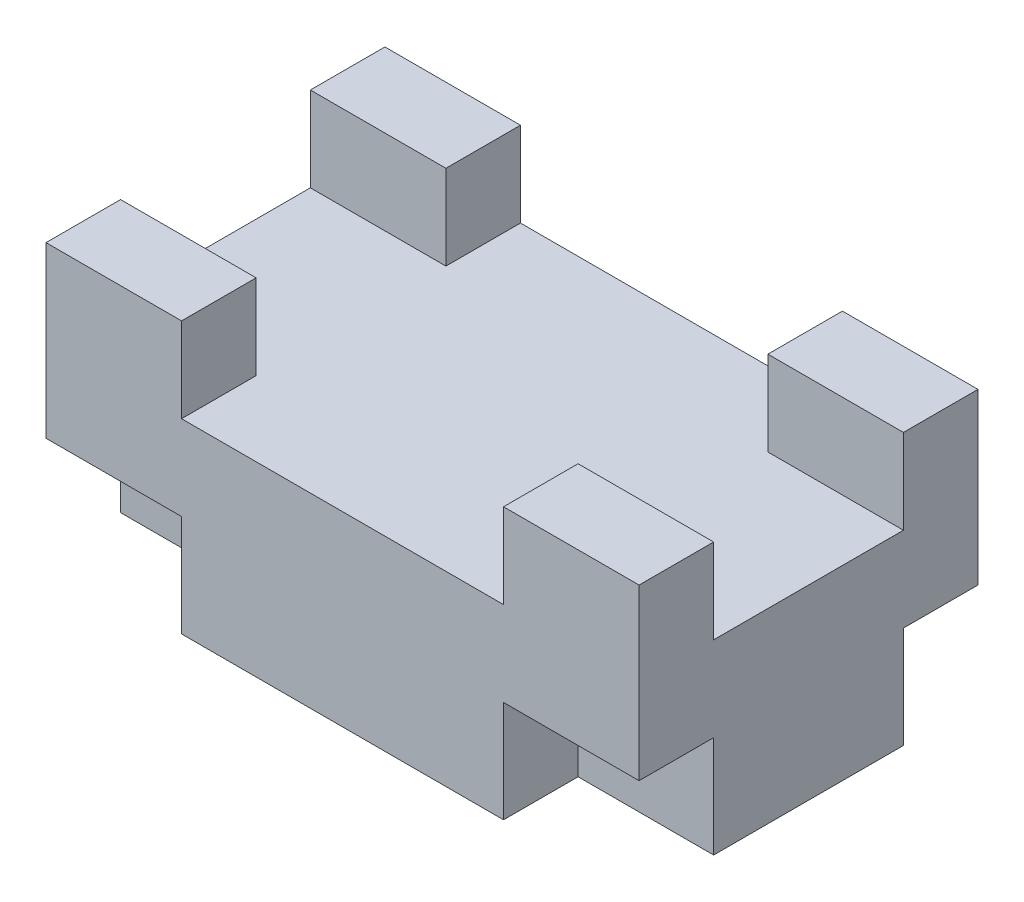
ISO-10303-21;
HEADER;
FILE_DESCRIPTION(('STEP AP214'),'2;1');
FILE_NAME('part.step','',(''),(''),'','','');
FILE_SCHEMA(('AUTOMOTIVE_DESIGN { 1 0 10303 214 1 1 1 1 }'));
ENDSEC;
DATA;
#1=APPLICATION_CONTEXT('core data for automotive mechanical design processes');
#2=APPLICATION_PROTOCOL_DEFINITION('international standard','automotive_design',2000,#1);
#3=PRODUCT_CONTEXT('',#1,'mechanical');
#4=PRODUCT('Part','Part','',(#3));
#5=PRODUCT_RELATED_PRODUCT_CATEGORY('part','',(#4));
#6=PRODUCT_DEFINITION_FORMATION('','',#4);
#7=PRODUCT_DEFINITION_CONTEXT('part definition',#1,'design');
#8=PRODUCT_DEFINITION('design','',#6,#7);
#9=PRODUCT_DEFINITION_SHAPE('','',#8);
#10=(LENGTH_UNIT() NAMED_UNIT(*) SI_UNIT(.MILLI.,.METRE.));
#11=(NAMED_UNIT(*) PLANE_ANGLE_UNIT() SI_UNIT($,.RADIAN.));
#12=(NAMED_UNIT(*) SI_UNIT($,.STERADIAN.) SOLID_ANGLE_UNIT());
#13=UNCERTAINTY_MEASURE_WITH_UNIT(LENGTH_MEASURE(1.E-05),#10,'distance_accuracy_value','');
#14=(GEOMETRIC_REPRESENTATION_CONTEXT(3) GLOBAL_UNCERTAINTY_ASSIGNED_CONTEXT((#13)) GLOBAL_UNIT_ASSIGNED_CONTEXT((#10,
#11,#12)) REPRESENTATION_CONTEXT('',''));
#15=CARTESIAN_POINT('',(0.,0.,0.));
#16=DIRECTION('',(0.,0.,1.));
#17=DIRECTION('',(1.,0.,0.));
#18=AXIS2_PLACEMENT_3D('',#15,#16,#17);
#19=CARTESIAN_POINT('',(0.,55.,0.));
#20=DIRECTION('',(0.,1.,0.));
#21=DIRECTION('',(0.,0.,1.));
#22=AXIS2_PLACEMENT_3D('',#19,#20,#21);
#23=PLANE('',#22);
#24=DIRECTION('',(-1.,0.,0.));
#25=VECTOR('',#24,1.);
#26=CARTESIAN_POINT('',(-47.5,55.,28.));
#27=LINE('',#26,#25);
#28=CARTESIAN_POINT('',(-47.5,55.,28.));
#29=VERTEX_POINT('',#28);
#30=CARTESIAN_POINT('',(-87.5,55.,28.));
#31=VERTEX_POINT('',#30);
#32=EDGE_CURVE('E529',#29,#31,#27,.T.);
#33=ORIENTED_EDGE('',*,*,#32,.F.);
#34=DIRECTION('',(0.,0.,-1.));
#35=VECTOR('',#34,1.);
#36=CARTESIAN_POINT('',(-47.5,55.,50.));
#37=LINE('',#36,#35);
#38=CARTESIAN_POINT('',(-47.5,55.,50.));
#39=VERTEX_POINT('',#38);
#40=EDGE_CURVE('E370',#39,#29,#37,.T.);
#41=ORIENTED_EDGE('',*,*,#40,.F.);
#42=DIRECTION('',(1.,0.,0.));
#43=VECTOR('',#42,1.);
#44=CARTESIAN_POINT('',(-87.5,55.,50.));
#45=LINE('',#44,#43);
#46=CARTESIAN_POINT('',(47.5,55.,50.));
#47=VERTEX_POINT('',#46);
#48=EDGE_CURVE('E272',#39,#47,#45,.T.);
#49=ORIENTED_EDGE('',*,*,#48,.T.);
#50=DIRECTION('',(0.,0.,1.));
#51=VECTOR('',#50,1.);
#52=CARTESIAN_POINT('',(47.5,55.,50.));
#53=LINE('',#52,#51);
#54=CARTESIAN_POINT('',(47.5,55.,28.));
#55=VERTEX_POINT('',#54);
#56=EDGE_CURVE('E367',#55,#47,#53,.T.);
#57=ORIENTED_EDGE('',*,*,#56,.F.);
#58=DIRECTION('',(-1.,0.,0.));
#59=VECTOR('',#58,1.);
#60=CARTESIAN_POINT('',(47.5,55.,28.));
#61=LINE('',#60,#59);
#62=CARTESIAN_POINT('',(87.5,55.,28.));
#63=VERTEX_POINT('',#62);
#64=EDGE_CURVE('E391',#63,#55,#61,.T.);
#65=ORIENTED_EDGE('',*,*,#64,.F.);
#66=DIRECTION('',(0.,0.,-1.));
#67=VECTOR('',#66,1.);
#68=CARTESIAN_POINT('',(87.5,55.,-50.));
#69=LINE('',#68,#67);
#70=CARTESIAN_POINT('',(87.5,55.,-28.));
#71=VERTEX_POINT('',#70);
#72=EDGE_CURVE('E282',#63,#71,#69,.T.);
#73=ORIENTED_EDGE('',*,*,#72,.T.);
#74=DIRECTION('',(1.,0.,0.));
#75=VECTOR('',#74,1.);
#76=CARTESIAN_POINT('',(47.5,55.,-28.));
#77=LINE('',#76,#75);
#78=CARTESIAN_POINT('',(47.5,55.,-28.));
#79=VERTEX_POINT('',#78);
#80=EDGE_CURVE('E327',#79,#71,#77,.T.);
#81=ORIENTED_EDGE('',*,*,#80,.F.);
#82=DIRECTION('',(0.,0.,1.));
#83=VECTOR('',#82,1.);
#84=CARTESIAN_POINT('',(47.5,55.,-50.));
#85=LINE('',#84,#83);
#86=CARTESIAN_POINT('',(47.5,55.,-50.));
#87=VERTEX_POINT('',#86);
#88=EDGE_CURVE('E338',#87,#79,#85,.T.);
#89=ORIENTED_EDGE('',*,*,#88,.F.);
#90=DIRECTION('',(-1.,0.,0.));
#91=VECTOR('',#90,1.);
#92=CARTESIAN_POINT('',(-87.5,55.,-50.));
#93=LINE('',#92,#91);
#94=CARTESIAN_POINT('',(-47.5,55.,-50.));
#95=VERTEX_POINT('',#94);
#96=EDGE_CURVE('E354',#87,#95,#93,.T.);
#97=ORIENTED_EDGE('',*,*,#96,.T.);
#98=DIRECTION('',(0.,0.,-1.));
#99=VECTOR('',#98,1.);
#100=CARTESIAN_POINT('',(-47.5,55.,-50.));
#101=LINE('',#100,#99);
#102=CARTESIAN_POINT('',(-47.5,55.,-28.));
#103=VERTEX_POINT('',#102);
#104=EDGE_CURVE('E342',#103,#95,#101,.T.);
#105=ORIENTED_EDGE('',*,*,#104,.F.);
#106=DIRECTION('',(1.,0.,0.));
#107=VECTOR('',#106,1.);
#108=CARTESIAN_POINT('',(-47.5,55.,-28.));
#109=LINE('',#108,#107);
#110=CARTESIAN_POINT('',(-87.5,55.,-28.));
#111=VERTEX_POINT('',#110);
#112=EDGE_CURVE('E316',#111,#103,#109,.T.);
#113=ORIENTED_EDGE('',*,*,#112,.F.);
#114=DIRECTION('',(0.,0.,1.));
#115=VECTOR('',#114,1.);
#116=CARTESIAN_POINT('',(-87.5,55.,-50.));
#117=LINE('',#116,#115);
#118=EDGE_CURVE('E357',#111,#31,#117,.T.);
#119=ORIENTED_EDGE('',*,*,#118,.T.);
#120=EDGE_LOOP('',(#33,#41,#49,#57,#65,#73,#81,#89,#97,#105,#113,#119));
#121=FACE_BOUND('',#120,.T.);
#122=ADVANCED_FACE('F43',(#121),#23,.T.);
#123=CARTESIAN_POINT('',(87.5,55.,-50.));
#124=DIRECTION('',(-1.,0.,0.));
#125=DIRECTION('',(0.,0.,1.));
#126=AXIS2_PLACEMENT_3D('',#123,#124,#125);
#127=PLANE('',#126);
#128=DIRECTION('',(0.,0.,-1.));
#129=VECTOR('',#128,1.);
#130=CARTESIAN_POINT('',(87.5,0.,-50.));
#131=LINE('',#130,#129);
#132=CARTESIAN_POINT('',(87.5,0.,28.));
#133=VERTEX_POINT('',#132);
#134=CARTESIAN_POINT('',(87.5,0.,-28.));
#135=VERTEX_POINT('',#134);
#136=EDGE_CURVE('E249',#133,#135,#131,.T.);
#137=ORIENTED_EDGE('',*,*,#136,.T.);
#138=DIRECTION('',(0.,-1.,0.));
#139=VECTOR('',#138,1.);
#140=CARTESIAN_POINT('',(87.5,30.,-28.));
#141=LINE('',#140,#139);
#142=CARTESIAN_POINT('',(87.5,30.,-28.));
#143=VERTEX_POINT('',#142);
#144=EDGE_CURVE('E446',#143,#135,#141,.T.);
#145=ORIENTED_EDGE('',*,*,#144,.F.);
#146=DIRECTION('',(0.,0.,1.));
#147=VECTOR('',#146,1.);
#148=CARTESIAN_POINT('',(87.5,30.,-50.));
#149=LINE('',#148,#147);
#150=CARTESIAN_POINT('',(87.5,30.,-50.));
#151=VERTEX_POINT('',#150);
#152=EDGE_CURVE('E445',#151,#143,#149,.T.);
#153=ORIENTED_EDGE('',*,*,#152,.F.);
#154=DIRECTION('',(0.,-1.,0.));
#155=VECTOR('',#154,1.);
#156=CARTESIAN_POINT('',(87.5,55.,-50.));
#157=LINE('',#156,#155);
#158=CARTESIAN_POINT('',(87.5,80.,-50.));
#159=VERTEX_POINT('',#158);
#160=EDGE_CURVE('E11',#159,#151,#157,.T.);
#161=ORIENTED_EDGE('',*,*,#160,.F.);
#162=DIRECTION('',(0.,0.,-1.));
#163=VECTOR('',#162,1.);
#164=CARTESIAN_POINT('',(87.5,80.,-50.));
#165=LINE('',#164,#163);
#166=CARTESIAN_POINT('',(87.5,80.,-28.));
#167=VERTEX_POINT('',#166);
#168=EDGE_CURVE('E330',#167,#159,#165,.T.);
#169=ORIENTED_EDGE('',*,*,#168,.F.);
#170=DIRECTION('',(0.,-1.,0.));
#171=VECTOR('',#170,1.);
#172=CARTESIAN_POINT('',(87.5,80.,-28.));
#173=LINE('',#172,#171);
#174=EDGE_CURVE('E269',#167,#71,#173,.T.);
#175=ORIENTED_EDGE('',*,*,#174,.T.);
#176=ORIENTED_EDGE('',*,*,#72,.F.);
#177=DIRECTION('',(0.,-1.,0.));
#178=VECTOR('',#177,1.);
#179=CARTESIAN_POINT('',(87.5,80.,28.));
#180=LINE('',#179,#178);
#181=CARTESIAN_POINT('',(87.5,80.,28.));
#182=VERTEX_POINT('',#181);
#183=EDGE_CURVE('E383',#182,#63,#180,.T.);
#184=ORIENTED_EDGE('',*,*,#183,.F.);
#185=DIRECTION('',(0.,0.,-1.));
#186=VECTOR('',#185,1.);
#187=CARTESIAN_POINT('',(87.5,80.,50.));
#188=LINE('',#187,#186);
#189=CARTESIAN_POINT('',(87.5,80.,50.));
#190=VERTEX_POINT('',#189);
#191=EDGE_CURVE('E404',#190,#182,#188,.T.);
#192=ORIENTED_EDGE('',*,*,#191,.F.);
#193=DIRECTION('',(0.,-1.,0.));
#194=VECTOR('',#193,1.);
#195=CARTESIAN_POINT('',(87.5,55.,50.));
#196=LINE('',#195,#194);
#197=CARTESIAN_POINT('',(87.5,30.,50.));
#198=VERTEX_POINT('',#197);
#199=EDGE_CURVE('E283',#190,#198,#196,.T.);
#200=ORIENTED_EDGE('',*,*,#199,.T.);
#201=DIRECTION('',(0.,0.,1.));
#202=VECTOR('',#201,1.);
#203=CARTESIAN_POINT('',(87.5,30.,50.));
#204=LINE('',#203,#202);
#205=CARTESIAN_POINT('',(87.5,30.,28.));
#206=VERTEX_POINT('',#205);
#207=EDGE_CURVE('E243',#206,#198,#204,.T.);
#208=ORIENTED_EDGE('',*,*,#207,.F.);
#209=DIRECTION('',(0.,-1.,0.));
#210=VECTOR('',#209,1.);
#211=CARTESIAN_POINT('',(87.5,30.,28.));
#212=LINE('',#211,#210);
#213=EDGE_CURVE('E234',#206,#133,#212,.T.);
#214=ORIENTED_EDGE('',*,*,#213,.T.);
#215=EDGE_LOOP('',(#137,#145,#153,#161,#169,#175,#176,#184,#192,#200,#208,#214));
#216=FACE_BOUND('',#215,.T.);
#217=ADVANCED_FACE('F45',(#216),#127,.F.);
#218=CARTESIAN_POINT('',(-87.5,55.,-50.));
#219=DIRECTION('',(0.,0.,1.));
#220=DIRECTION('',(1.,0.,0.));
#221=AXIS2_PLACEMENT_3D('',#218,#219,#220);
#222=PLANE('',#221);
#223=DIRECTION('',(-1.,0.,0.));
#224=VECTOR('',#223,1.);
#225=CARTESIAN_POINT('',(-87.5,0.,-50.));
#226=LINE('',#225,#224);
#227=CARTESIAN_POINT('',(47.5,0.,-50.));
#228=VERTEX_POINT('',#227);
#229=CARTESIAN_POINT('',(-47.5,0.,-50.));
#230=VERTEX_POINT('',#229);
#231=EDGE_CURVE('E260',#228,#230,#226,.T.);
#232=ORIENTED_EDGE('',*,*,#231,.T.);
#233=DIRECTION('',(0.,-1.,0.));
#234=VECTOR('',#233,1.);
#235=CARTESIAN_POINT('',(-47.5,30.,-50.));
#236=LINE('',#235,#234);
#237=CARTESIAN_POINT('',(-47.5,30.,-50.));
#238=VERTEX_POINT('',#237);
#239=EDGE_CURVE('E59',#238,#230,#236,.T.);
#240=ORIENTED_EDGE('',*,*,#239,.F.);
#241=DIRECTION('',(1.,0.,0.));
#242=VECTOR('',#241,1.);
#243=CARTESIAN_POINT('',(-87.5,30.,-50.));
#244=LINE('',#243,#242);
#245=CARTESIAN_POINT('',(-87.5,30.,-50.));
#246=VERTEX_POINT('',#245);
#247=EDGE_CURVE('E306',#246,#238,#244,.T.);
#248=ORIENTED_EDGE('',*,*,#247,.F.);
#249=DIRECTION('',(0.,-1.,0.));
#250=VECTOR('',#249,1.);
#251=CARTESIAN_POINT('',(-87.5,55.,-50.));
#252=LINE('',#251,#250);
#253=CARTESIAN_POINT('',(-87.5,80.,-50.));
#254=VERTEX_POINT('',#253);
#255=EDGE_CURVE('E52',#254,#246,#252,.T.);
#256=ORIENTED_EDGE('',*,*,#255,.F.);
#257=DIRECTION('',(-1.,0.,0.));
#258=VECTOR('',#257,1.);
#259=CARTESIAN_POINT('',(-47.5,80.,-50.));
#260=LINE('',#259,#258);
#261=CARTESIAN_POINT('',(-47.5,80.,-50.));
#262=VERTEX_POINT('',#261);
#263=EDGE_CURVE('E303',#262,#254,#260,.T.);
#264=ORIENTED_EDGE('',*,*,#263,.F.);
#265=DIRECTION('',(0.,-1.,0.));
#266=VECTOR('',#265,1.);
#267=CARTESIAN_POINT('',(-47.5,80.,-50.));
#268=LINE('',#267,#266);
#269=EDGE_CURVE('E390',#262,#95,#268,.T.);
#270=ORIENTED_EDGE('',*,*,#269,.T.);
#271=ORIENTED_EDGE('',*,*,#96,.F.);
#272=DIRECTION('',(0.,-1.,0.));
#273=VECTOR('',#272,1.);
#274=CARTESIAN_POINT('',(47.5,80.,-50.));
#275=LINE('',#274,#273);
#276=CARTESIAN_POINT('',(47.5,80.,-50.));
#277=VERTEX_POINT('',#276);
#278=EDGE_CURVE('E337',#277,#87,#275,.T.);
#279=ORIENTED_EDGE('',*,*,#278,.F.);
#280=DIRECTION('',(-1.,0.,0.));
#281=VECTOR('',#280,1.);
#282=CARTESIAN_POINT('',(47.5,80.,-50.));
#283=LINE('',#282,#281);
#284=EDGE_CURVE('E334',#159,#277,#283,.T.);
#285=ORIENTED_EDGE('',*,*,#284,.F.);
#286=ORIENTED_EDGE('',*,*,#160,.T.);
#287=DIRECTION('',(1.,0.,0.));
#288=VECTOR('',#287,1.);
#289=CARTESIAN_POINT('',(87.5,30.,-50.));
#290=LINE('',#289,#288);
#291=CARTESIAN_POINT('',(47.5,30.,-50.));
#292=VERTEX_POINT('',#291);
#293=EDGE_CURVE('E442',#292,#151,#290,.T.);
#294=ORIENTED_EDGE('',*,*,#293,.F.);
#295=DIRECTION('',(0.,-1.,0.));
#296=VECTOR('',#295,1.);
#297=CARTESIAN_POINT('',(47.5,30.,-50.));
#298=LINE('',#297,#296);
#299=EDGE_CURVE('E475',#292,#228,#298,.T.);
#300=ORIENTED_EDGE('',*,*,#299,.T.);
#301=EDGE_LOOP('',(#232,#240,#248,#256,#264,#270,#271,#279,#285,#286,#294,#300));
#302=FACE_BOUND('',#301,.T.);
#303=ADVANCED_FACE('F302',(#302),#222,.F.);
#304=CARTESIAN_POINT('',(-87.5,55.,-50.));
#305=DIRECTION('',(1.,0.,0.));
#306=DIRECTION('',(0.,0.,-1.));
#307=AXIS2_PLACEMENT_3D('',#304,#305,#306);
#308=PLANE('',#307);
#309=DIRECTION('',(0.,0.,-1.));
#310=VECTOR('',#309,1.);
#311=CARTESIAN_POINT('',(-87.5,30.,-50.));
#312=LINE('',#311,#310);
#313=CARTESIAN_POINT('',(-87.5,30.,-28.));
#314=VERTEX_POINT('',#313);
#315=EDGE_CURVE('E296',#314,#246,#312,.T.);
#316=ORIENTED_EDGE('',*,*,#315,.F.);
#317=DIRECTION('',(0.,-1.,0.));
#318=VECTOR('',#317,1.);
#319=CARTESIAN_POINT('',(-87.5,30.,-28.));
#320=LINE('',#319,#318);
#321=CARTESIAN_POINT('',(-87.5,0.,-28.));
#322=VERTEX_POINT('',#321);
#323=EDGE_CURVE('E466',#314,#322,#320,.T.);
#324=ORIENTED_EDGE('',*,*,#323,.T.);
#325=DIRECTION('',(0.,0.,1.));
#326=VECTOR('',#325,1.);
#327=CARTESIAN_POINT('',(-87.5,0.,-50.));
#328=LINE('',#327,#326);
#329=CARTESIAN_POINT('',(-87.5,0.,28.));
#330=VERTEX_POINT('',#329);
#331=EDGE_CURVE('E266',#322,#330,#328,.T.);
#332=ORIENTED_EDGE('',*,*,#331,.T.);
#333=DIRECTION('',(0.,-1.,0.));
#334=VECTOR('',#333,1.);
#335=CARTESIAN_POINT('',(-87.5,30.,28.));
#336=LINE('',#335,#334);
#337=CARTESIAN_POINT('',(-87.5,30.,28.));
#338=VERTEX_POINT('',#337);
#339=EDGE_CURVE('E67',#338,#330,#336,.T.);
#340=ORIENTED_EDGE('',*,*,#339,.F.);
#341=DIRECTION('',(0.,0.,-1.));
#342=VECTOR('',#341,1.);
#343=CARTESIAN_POINT('',(-87.5,30.,50.));
#344=LINE('',#343,#342);
#345=CARTESIAN_POINT('',(-87.5,30.,50.));
#346=VERTEX_POINT('',#345);
#347=EDGE_CURVE('E487',#346,#338,#344,.T.);
#348=ORIENTED_EDGE('',*,*,#347,.F.);
#349=DIRECTION('',(0.,-1.,0.));
#350=VECTOR('',#349,1.);
#351=CARTESIAN_POINT('',(-87.5,55.,50.));
#352=LINE('',#351,#350);
#353=CARTESIAN_POINT('',(-87.5,80.,50.));
#354=VERTEX_POINT('',#353);
#355=EDGE_CURVE('E286',#354,#346,#352,.T.);
#356=ORIENTED_EDGE('',*,*,#355,.F.);
#357=DIRECTION('',(0.,0.,1.));
#358=VECTOR('',#357,1.);
#359=CARTESIAN_POINT('',(-87.5,80.,50.));
#360=LINE('',#359,#358);
#361=CARTESIAN_POINT('',(-87.5,80.,28.));
#362=VERTEX_POINT('',#361);
#363=EDGE_CURVE('E528',#362,#354,#360,.T.);
#364=ORIENTED_EDGE('',*,*,#363,.F.);
#365=DIRECTION('',(0.,-1.,0.));
#366=VECTOR('',#365,1.);
#367=CARTESIAN_POINT('',(-87.5,80.,28.));
#368=LINE('',#367,#366);
#369=EDGE_CURVE('E524',#362,#31,#368,.T.);
#370=ORIENTED_EDGE('',*,*,#369,.T.);
#371=ORIENTED_EDGE('',*,*,#118,.F.);
#372=DIRECTION('',(0.,-1.,0.));
#373=VECTOR('',#372,1.);
#374=CARTESIAN_POINT('',(-87.5,80.,-28.));
#375=LINE('',#374,#373);
#376=CARTESIAN_POINT('',(-87.5,80.,-28.));
#377=VERTEX_POINT('',#376);
#378=EDGE_CURVE('E395',#377,#111,#375,.T.);
#379=ORIENTED_EDGE('',*,*,#378,.F.);
#380=DIRECTION('',(0.,0.,1.));
#381=VECTOR('',#380,1.);
#382=CARTESIAN_POINT('',(-87.5,80.,-50.));
#383=LINE('',#382,#381);
#384=EDGE_CURVE('E298',#254,#377,#383,.T.);
#385=ORIENTED_EDGE('',*,*,#384,.F.);
#386=ORIENTED_EDGE('',*,*,#255,.T.);
#387=EDGE_LOOP('',(#316,#324,#332,#340,#348,#356,#364,#370,#371,#379,#385,#386));
#388=FACE_BOUND('',#387,.T.);
#389=ADVANCED_FACE('F294',(#388),#308,.F.);
#390=CARTESIAN_POINT('',(-87.5,55.,50.));
#391=DIRECTION('',(0.,0.,-1.));
#392=DIRECTION('',(-1.,0.,0.));
#393=AXIS2_PLACEMENT_3D('',#390,#391,#392);
#394=PLANE('',#393);
#395=DIRECTION('',(1.,0.,0.));
#396=VECTOR('',#395,1.);
#397=CARTESIAN_POINT('',(-87.5,0.,50.));
#398=LINE('',#397,#396);
#399=CARTESIAN_POINT('',(-47.5,0.,50.));
#400=VERTEX_POINT('',#399);
#401=CARTESIAN_POINT('',(47.5,0.,50.));
#402=VERTEX_POINT('',#401);
#403=EDGE_CURVE('E278',#400,#402,#398,.T.);
#404=ORIENTED_EDGE('',*,*,#403,.T.);
#405=DIRECTION('',(0.,-1.,0.));
#406=VECTOR('',#405,1.);
#407=CARTESIAN_POINT('',(47.5,30.,50.));
#408=LINE('',#407,#406);
#409=CARTESIAN_POINT('',(47.5,30.,50.));
#410=VERTEX_POINT('',#409);
#411=EDGE_CURVE('E565',#410,#402,#408,.T.);
#412=ORIENTED_EDGE('',*,*,#411,.F.);
#413=DIRECTION('',(-1.,0.,0.));
#414=VECTOR('',#413,1.);
#415=CARTESIAN_POINT('',(87.5,30.,50.));
#416=LINE('',#415,#414);
#417=EDGE_CURVE('E554',#198,#410,#416,.T.);
#418=ORIENTED_EDGE('',*,*,#417,.F.);
#419=ORIENTED_EDGE('',*,*,#199,.F.);
#420=DIRECTION('',(1.,0.,0.));
#421=VECTOR('',#420,1.);
#422=CARTESIAN_POINT('',(47.5,80.,50.));
#423=LINE('',#422,#421);
#424=CARTESIAN_POINT('',(47.5,80.,50.));
#425=VERTEX_POINT('',#424);
#426=EDGE_CURVE('E378',#425,#190,#423,.T.);
#427=ORIENTED_EDGE('',*,*,#426,.F.);
#428=DIRECTION('',(0.,-1.,0.));
#429=VECTOR('',#428,1.);
#430=CARTESIAN_POINT('',(47.5,80.,50.));
#431=LINE('',#430,#429);
#432=EDGE_CURVE('E375',#425,#47,#431,.T.);
#433=ORIENTED_EDGE('',*,*,#432,.T.);
#434=ORIENTED_EDGE('',*,*,#48,.F.);
#435=DIRECTION('',(0.,-1.,0.));
#436=VECTOR('',#435,1.);
#437=CARTESIAN_POINT('',(-47.5,80.,50.));
#438=LINE('',#437,#436);
#439=CARTESIAN_POINT('',(-47.5,80.,50.));
#440=VERTEX_POINT('',#439);
#441=EDGE_CURVE('E512',#440,#39,#438,.T.);
#442=ORIENTED_EDGE('',*,*,#441,.F.);
#443=DIRECTION('',(1.,0.,0.));
#444=VECTOR('',#443,1.);
#445=CARTESIAN_POINT('',(-47.5,80.,50.));
#446=LINE('',#445,#444);
#447=EDGE_CURVE('E532',#354,#440,#446,.T.);
#448=ORIENTED_EDGE('',*,*,#447,.F.);
#449=ORIENTED_EDGE('',*,*,#355,.T.);
#450=DIRECTION('',(-1.,0.,0.));
#451=VECTOR('',#450,1.);
#452=CARTESIAN_POINT('',(-87.5,30.,50.));
#453=LINE('',#452,#451);
#454=CARTESIAN_POINT('',(-47.5,30.,50.));
#455=VERTEX_POINT('',#454);
#456=EDGE_CURVE('E500',#455,#346,#453,.T.);
#457=ORIENTED_EDGE('',*,*,#456,.F.);
#458=DIRECTION('',(0.,-1.,0.));
#459=VECTOR('',#458,1.);
#460=CARTESIAN_POINT('',(-47.5,30.,50.));
#461=LINE('',#460,#459);
#462=EDGE_CURVE('E508',#455,#400,#461,.T.);
#463=ORIENTED_EDGE('',*,*,#462,.T.);
#464=EDGE_LOOP('',(#404,#412,#418,#419,#427,#433,#434,#442,#448,#449,#457,#463));
#465=FACE_BOUND('',#464,.T.);
#466=ADVANCED_FACE('F376',(#465),#394,.F.);
#467=CARTESIAN_POINT('',(0.,0.,0.));
#468=DIRECTION('',(0.,1.,0.));
#469=DIRECTION('',(0.,0.,1.));
#470=AXIS2_PLACEMENT_3D('',#467,#468,#469);
#471=PLANE('',#470);
#472=ORIENTED_EDGE('',*,*,#331,.F.);
#473=DIRECTION('',(-1.,0.,0.));
#474=VECTOR('',#473,1.);
#475=CARTESIAN_POINT('',(-87.5,0.,-28.));
#476=LINE('',#475,#474);
#477=CARTESIAN_POINT('',(-47.5,0.,-28.));
#478=VERTEX_POINT('',#477);
#479=EDGE_CURVE('E469',#478,#322,#476,.T.);
#480=ORIENTED_EDGE('',*,*,#479,.F.);
#481=DIRECTION('',(0.,0.,1.));
#482=VECTOR('',#481,1.);
#483=CARTESIAN_POINT('',(-47.5,0.,-50.));
#484=LINE('',#483,#482);
#485=EDGE_CURVE('E472',#230,#478,#484,.T.);
#486=ORIENTED_EDGE('',*,*,#485,.F.);
#487=ORIENTED_EDGE('',*,*,#231,.F.);
#488=DIRECTION('',(0.,0.,-1.));
#489=VECTOR('',#488,1.);
#490=CARTESIAN_POINT('',(47.5,0.,-50.));
#491=LINE('',#490,#489);
#492=CARTESIAN_POINT('',(47.5,0.,-28.));
#493=VERTEX_POINT('',#492);
#494=EDGE_CURVE('E454',#493,#228,#491,.T.);
#495=ORIENTED_EDGE('',*,*,#494,.F.);
#496=DIRECTION('',(-1.,0.,0.));
#497=VECTOR('',#496,1.);
#498=CARTESIAN_POINT('',(87.5,0.,-28.));
#499=LINE('',#498,#497);
#500=EDGE_CURVE('E252',#135,#493,#499,.T.);
#501=ORIENTED_EDGE('',*,*,#500,.F.);
#502=ORIENTED_EDGE('',*,*,#136,.F.);
#503=DIRECTION('',(1.,0.,0.));
#504=VECTOR('',#503,1.);
#505=CARTESIAN_POINT('',(87.5,0.,28.));
#506=LINE('',#505,#504);
#507=CARTESIAN_POINT('',(47.5,0.,28.));
#508=VERTEX_POINT('',#507);
#509=EDGE_CURVE('E230',#508,#133,#506,.T.);
#510=ORIENTED_EDGE('',*,*,#509,.F.);
#511=DIRECTION('',(0.,0.,-1.));
#512=VECTOR('',#511,1.);
#513=CARTESIAN_POINT('',(47.5,0.,50.));
#514=LINE('',#513,#512);
#515=EDGE_CURVE('E242',#402,#508,#514,.T.);
#516=ORIENTED_EDGE('',*,*,#515,.F.);
#517=ORIENTED_EDGE('',*,*,#403,.F.);
#518=DIRECTION('',(0.,0.,1.));
#519=VECTOR('',#518,1.);
#520=CARTESIAN_POINT('',(-47.5,0.,50.));
#521=LINE('',#520,#519);
#522=CARTESIAN_POINT('',(-47.5,0.,28.));
#523=VERTEX_POINT('',#522);
#524=EDGE_CURVE('E492',#523,#400,#521,.T.);
#525=ORIENTED_EDGE('',*,*,#524,.F.);
#526=DIRECTION('',(1.,0.,0.));
#527=VECTOR('',#526,1.);
#528=CARTESIAN_POINT('',(-87.5,0.,28.));
#529=LINE('',#528,#527);
#530=EDGE_CURVE('E503',#330,#523,#529,.T.);
#531=ORIENTED_EDGE('',*,*,#530,.F.);
#532=EDGE_LOOP('',(#472,#480,#486,#487,#495,#501,#502,#510,#516,#517,#525,#531));
#533=FACE_BOUND('',#532,.T.);
#534=ADVANCED_FACE('F256',(#533),#471,.F.);
#535=CARTESIAN_POINT('',(47.5,80.,-50.));
#536=DIRECTION('',(1.,0.,0.));
#537=DIRECTION('',(0.,0.,-1.));
#538=AXIS2_PLACEMENT_3D('',#535,#536,#537);
#539=PLANE('',#538);
#540=ORIENTED_EDGE('',*,*,#88,.T.);
#541=DIRECTION('',(0.,-1.,0.));
#542=VECTOR('',#541,1.);
#543=CARTESIAN_POINT('',(47.5,80.,-28.));
#544=LINE('',#543,#542);
#545=CARTESIAN_POINT('',(47.5,80.,-28.));
#546=VERTEX_POINT('',#545);
#547=EDGE_CURVE('E261',#546,#79,#544,.T.);
#548=ORIENTED_EDGE('',*,*,#547,.F.);
#549=DIRECTION('',(0.,0.,1.));
#550=VECTOR('',#549,1.);
#551=CARTESIAN_POINT('',(47.5,80.,-50.));
#552=LINE('',#551,#550);
#553=EDGE_CURVE('E322',#277,#546,#552,.T.);
#554=ORIENTED_EDGE('',*,*,#553,.F.);
#555=ORIENTED_EDGE('',*,*,#278,.T.);
#556=EDGE_LOOP('',(#540,#548,#554,#555));
#557=FACE_BOUND('',#556,.T.);
#558=ADVANCED_FACE('F434',(#557),#539,.F.);
#559=CARTESIAN_POINT('',(47.5,80.,-28.));
#560=DIRECTION('',(0.,0.,-1.));
#561=DIRECTION('',(-1.,0.,0.));
#562=AXIS2_PLACEMENT_3D('',#559,#560,#561);
#563=PLANE('',#562);
#564=ORIENTED_EDGE('',*,*,#80,.T.);
#565=ORIENTED_EDGE('',*,*,#174,.F.);
#566=DIRECTION('',(1.,0.,0.));
#567=VECTOR('',#566,1.);
#568=CARTESIAN_POINT('',(47.5,80.,-28.));
#569=LINE('',#568,#567);
#570=EDGE_CURVE('E326',#546,#167,#569,.T.);
#571=ORIENTED_EDGE('',*,*,#570,.F.);
#572=ORIENTED_EDGE('',*,*,#547,.T.);
#573=EDGE_LOOP('',(#564,#565,#571,#572));
#574=FACE_BOUND('',#573,.T.);
#575=ADVANCED_FACE('F664',(#574),#563,.F.);
#576=CARTESIAN_POINT('',(0.,80.,0.));
#577=DIRECTION('',(0.,1.,0.));
#578=DIRECTION('',(0.,0.,1.));
#579=AXIS2_PLACEMENT_3D('',#576,#577,#578);
#580=PLANE('',#579);
#581=ORIENTED_EDGE('',*,*,#553,.T.);
#582=ORIENTED_EDGE('',*,*,#570,.T.);
#583=ORIENTED_EDGE('',*,*,#168,.T.);
#584=ORIENTED_EDGE('',*,*,#284,.T.);
#585=EDGE_LOOP('',(#581,#582,#583,#584));
#586=FACE_BOUND('',#585,.T.);
#587=ADVANCED_FACE('F437',(#586),#580,.T.);
#588=CARTESIAN_POINT('',(-47.5,80.,-50.));
#589=DIRECTION('',(-1.,0.,0.));
#590=DIRECTION('',(0.,0.,1.));
#591=AXIS2_PLACEMENT_3D('',#588,#589,#590);
#592=PLANE('',#591);
#593=ORIENTED_EDGE('',*,*,#104,.T.);
#594=ORIENTED_EDGE('',*,*,#269,.F.);
#595=DIRECTION('',(0.,0.,-1.));
#596=VECTOR('',#595,1.);
#597=CARTESIAN_POINT('',(-47.5,80.,-50.));
#598=LINE('',#597,#596);
#599=CARTESIAN_POINT('',(-47.5,80.,-28.));
#600=VERTEX_POINT('',#599);
#601=EDGE_CURVE('E310',#600,#262,#598,.T.);
#602=ORIENTED_EDGE('',*,*,#601,.F.);
#603=DIRECTION('',(0.,-1.,0.));
#604=VECTOR('',#603,1.);
#605=CARTESIAN_POINT('',(-47.5,80.,-28.));
#606=LINE('',#605,#604);
#607=EDGE_CURVE('E413',#600,#103,#606,.T.);
#608=ORIENTED_EDGE('',*,*,#607,.T.);
#609=EDGE_LOOP('',(#593,#594,#602,#608));
#610=FACE_BOUND('',#609,.T.);
#611=ADVANCED_FACE('F428',(#610),#592,.F.);
#612=CARTESIAN_POINT('',(-47.5,80.,-28.));
#613=DIRECTION('',(0.,0.,-1.));
#614=DIRECTION('',(-1.,0.,0.));
#615=AXIS2_PLACEMENT_3D('',#612,#613,#614);
#616=PLANE('',#615);
#617=ORIENTED_EDGE('',*,*,#112,.T.);
#618=ORIENTED_EDGE('',*,*,#607,.F.);
#619=DIRECTION('',(1.,0.,0.));
#620=VECTOR('',#619,1.);
#621=CARTESIAN_POINT('',(-47.5,80.,-28.));
#622=LINE('',#621,#620);
#623=EDGE_CURVE('E318',#377,#600,#622,.T.);
#624=ORIENTED_EDGE('',*,*,#623,.F.);
#625=ORIENTED_EDGE('',*,*,#378,.T.);
#626=EDGE_LOOP('',(#617,#618,#624,#625));
#627=FACE_BOUND('',#626,.T.);
#628=ADVANCED_FACE('F425',(#627),#616,.F.);
#629=CARTESIAN_POINT('',(0.,80.,0.));
#630=DIRECTION('',(0.,-1.,0.));
#631=DIRECTION('',(0.,0.,-1.));
#632=AXIS2_PLACEMENT_3D('',#629,#630,#631);
#633=PLANE('',#632);
#634=ORIENTED_EDGE('',*,*,#601,.T.);
#635=ORIENTED_EDGE('',*,*,#263,.T.);
#636=ORIENTED_EDGE('',*,*,#384,.T.);
#637=ORIENTED_EDGE('',*,*,#623,.T.);
#638=EDGE_LOOP('',(#634,#635,#636,#637));
#639=FACE_BOUND('',#638,.T.);
#640=ADVANCED_FACE('F308',(#639),#633,.F.);
#641=CARTESIAN_POINT('',(47.5,80.,50.));
#642=DIRECTION('',(1.,0.,0.));
#643=DIRECTION('',(0.,0.,-1.));
#644=AXIS2_PLACEMENT_3D('',#641,#642,#643);
#645=PLANE('',#644);
#646=ORIENTED_EDGE('',*,*,#56,.T.);
#647=ORIENTED_EDGE('',*,*,#432,.F.);
#648=DIRECTION('',(0.,0.,1.));
#649=VECTOR('',#648,1.);
#650=CARTESIAN_POINT('',(47.5,80.,50.));
#651=LINE('',#650,#649);
#652=CARTESIAN_POINT('',(47.5,80.,28.));
#653=VERTEX_POINT('',#652);
#654=EDGE_CURVE('E397',#653,#425,#651,.T.);
#655=ORIENTED_EDGE('',*,*,#654,.F.);
#656=DIRECTION('',(0.,-1.,0.));
#657=VECTOR('',#656,1.);
#658=CARTESIAN_POINT('',(47.5,80.,28.));
#659=LINE('',#658,#657);
#660=EDGE_CURVE('E388',#653,#55,#659,.T.);
#661=ORIENTED_EDGE('',*,*,#660,.T.);
#662=EDGE_LOOP('',(#646,#647,#655,#661));
#663=FACE_BOUND('',#662,.T.);
#664=ADVANCED_FACE('F386',(#663),#645,.F.);
#665=CARTESIAN_POINT('',(47.5,80.,28.));
#666=DIRECTION('',(0.,0.,1.));
#667=DIRECTION('',(1.,0.,0.));
#668=AXIS2_PLACEMENT_3D('',#665,#666,#667);
#669=PLANE('',#668);
#670=ORIENTED_EDGE('',*,*,#64,.T.);
#671=ORIENTED_EDGE('',*,*,#660,.F.);
#672=DIRECTION('',(-1.,0.,0.));
#673=VECTOR('',#672,1.);
#674=CARTESIAN_POINT('',(47.5,80.,28.));
#675=LINE('',#674,#673);
#676=EDGE_CURVE('E401',#182,#653,#675,.T.);
#677=ORIENTED_EDGE('',*,*,#676,.F.);
#678=ORIENTED_EDGE('',*,*,#183,.T.);
#679=EDGE_LOOP('',(#670,#671,#677,#678));
#680=FACE_BOUND('',#679,.T.);
#681=ADVANCED_FACE('F623',(#680),#669,.F.);
#682=CARTESIAN_POINT('',(0.,80.,0.));
#683=DIRECTION('',(0.,-1.,0.));
#684=DIRECTION('',(0.,0.,-1.));
#685=AXIS2_PLACEMENT_3D('',#682,#683,#684);
#686=PLANE('',#685);
#687=ORIENTED_EDGE('',*,*,#654,.T.);
#688=ORIENTED_EDGE('',*,*,#426,.T.);
#689=ORIENTED_EDGE('',*,*,#191,.T.);
#690=ORIENTED_EDGE('',*,*,#676,.T.);
#691=EDGE_LOOP('',(#687,#688,#689,#690));
#692=FACE_BOUND('',#691,.T.);
#693=ADVANCED_FACE('F616',(#692),#686,.F.);
#694=CARTESIAN_POINT('',(-47.5,80.,50.));
#695=DIRECTION('',(-1.,0.,0.));
#696=DIRECTION('',(0.,0.,1.));
#697=AXIS2_PLACEMENT_3D('',#694,#695,#696);
#698=PLANE('',#697);
#699=ORIENTED_EDGE('',*,*,#40,.T.);
#700=DIRECTION('',(0.,-1.,0.));
#701=VECTOR('',#700,1.);
#702=CARTESIAN_POINT('',(-47.5,80.,28.));
#703=LINE('',#702,#701);
#704=CARTESIAN_POINT('',(-47.5,80.,28.));
#705=VERTEX_POINT('',#704);
#706=EDGE_CURVE('E520',#705,#29,#703,.T.);
#707=ORIENTED_EDGE('',*,*,#706,.F.);
#708=DIRECTION('',(0.,0.,-1.));
#709=VECTOR('',#708,1.);
#710=CARTESIAN_POINT('',(-47.5,80.,50.));
#711=LINE('',#710,#709);
#712=EDGE_CURVE('E541',#440,#705,#711,.T.);
#713=ORIENTED_EDGE('',*,*,#712,.F.);
#714=ORIENTED_EDGE('',*,*,#441,.T.);
#715=EDGE_LOOP('',(#699,#707,#713,#714));
#716=FACE_BOUND('',#715,.T.);
#717=ADVANCED_FACE('F614',(#716),#698,.F.);
#718=CARTESIAN_POINT('',(-47.5,80.,28.));
#719=DIRECTION('',(0.,0.,1.));
#720=DIRECTION('',(1.,0.,0.));
#721=AXIS2_PLACEMENT_3D('',#718,#719,#720);
#722=PLANE('',#721);
#723=ORIENTED_EDGE('',*,*,#32,.T.);
#724=ORIENTED_EDGE('',*,*,#369,.F.);
#725=DIRECTION('',(-1.,0.,0.));
#726=VECTOR('',#725,1.);
#727=CARTESIAN_POINT('',(-47.5,80.,28.));
#728=LINE('',#727,#726);
#729=EDGE_CURVE('E538',#705,#362,#728,.T.);
#730=ORIENTED_EDGE('',*,*,#729,.F.);
#731=ORIENTED_EDGE('',*,*,#706,.T.);
#732=EDGE_LOOP('',(#723,#724,#730,#731));
#733=FACE_BOUND('',#732,.T.);
#734=ADVANCED_FACE('F612',(#733),#722,.F.);
#735=CARTESIAN_POINT('',(0.,80.,0.));
#736=DIRECTION('',(0.,-1.,0.));
#737=DIRECTION('',(0.,0.,-1.));
#738=AXIS2_PLACEMENT_3D('',#735,#736,#737);
#739=PLANE('',#738);
#740=ORIENTED_EDGE('',*,*,#447,.T.);
#741=ORIENTED_EDGE('',*,*,#712,.T.);
#742=ORIENTED_EDGE('',*,*,#729,.T.);
#743=ORIENTED_EDGE('',*,*,#363,.T.);
#744=EDGE_LOOP('',(#740,#741,#742,#743));
#745=FACE_BOUND('',#744,.T.);
#746=ADVANCED_FACE('F607',(#745),#739,.F.);
#747=CARTESIAN_POINT('',(-47.5,30.,50.));
#748=DIRECTION('',(1.,0.,0.));
#749=DIRECTION('',(0.,0.,-1.));
#750=AXIS2_PLACEMENT_3D('',#747,#748,#749);
#751=PLANE('',#750);
#752=ORIENTED_EDGE('',*,*,#524,.T.);
#753=ORIENTED_EDGE('',*,*,#462,.F.);
#754=DIRECTION('',(0.,0.,1.));
#755=VECTOR('',#754,1.);
#756=CARTESIAN_POINT('',(-47.5,30.,50.));
#757=LINE('',#756,#755);
#758=CARTESIAN_POINT('',(-47.5,30.,28.));
#759=VERTEX_POINT('',#758);
#760=EDGE_CURVE('E496',#759,#455,#757,.T.);
#761=ORIENTED_EDGE('',*,*,#760,.F.);
#762=DIRECTION('',(0.,-1.,0.));
#763=VECTOR('',#762,1.);
#764=CARTESIAN_POINT('',(-47.5,30.,28.));
#765=LINE('',#764,#763);
#766=EDGE_CURVE('E513',#759,#523,#765,.T.);
#767=ORIENTED_EDGE('',*,*,#766,.T.);
#768=EDGE_LOOP('',(#752,#753,#761,#767));
#769=FACE_BOUND('',#768,.T.);
#770=ADVANCED_FACE('F599',(#769),#751,.F.);
#771=CARTESIAN_POINT('',(-87.5,30.,28.));
#772=DIRECTION('',(0.,0.,-1.));
#773=DIRECTION('',(-1.,0.,0.));
#774=AXIS2_PLACEMENT_3D('',#771,#772,#773);
#775=PLANE('',#774);
#776=ORIENTED_EDGE('',*,*,#530,.T.);
#777=ORIENTED_EDGE('',*,*,#766,.F.);
#778=DIRECTION('',(1.,0.,0.));
#779=VECTOR('',#778,1.);
#780=CARTESIAN_POINT('',(-87.5,30.,28.));
#781=LINE('',#780,#779);
#782=EDGE_CURVE('E491',#338,#759,#781,.T.);
#783=ORIENTED_EDGE('',*,*,#782,.F.);
#784=ORIENTED_EDGE('',*,*,#339,.T.);
#785=EDGE_LOOP('',(#776,#777,#783,#784));
#786=FACE_BOUND('',#785,.T.);
#787=ADVANCED_FACE('F596',(#786),#775,.F.);
#788=CARTESIAN_POINT('',(0.,30.,0.));
#789=DIRECTION('',(0.,-1.,0.));
#790=DIRECTION('',(0.,0.,-1.));
#791=AXIS2_PLACEMENT_3D('',#788,#789,#790);
#792=PLANE('',#791);
#793=ORIENTED_EDGE('',*,*,#347,.T.);
#794=ORIENTED_EDGE('',*,*,#782,.T.);
#795=ORIENTED_EDGE('',*,*,#760,.T.);
#796=ORIENTED_EDGE('',*,*,#456,.T.);
#797=EDGE_LOOP('',(#793,#794,#795,#796));
#798=FACE_BOUND('',#797,.T.);
#799=ADVANCED_FACE('F602',(#798),#792,.T.);
#800=CARTESIAN_POINT('',(87.5,30.,28.));
#801=DIRECTION('',(0.,0.,-1.));
#802=DIRECTION('',(-1.,0.,0.));
#803=AXIS2_PLACEMENT_3D('',#800,#801,#802);
#804=PLANE('',#803);
#805=ORIENTED_EDGE('',*,*,#509,.T.);
#806=ORIENTED_EDGE('',*,*,#213,.F.);
#807=DIRECTION('',(1.,0.,0.));
#808=VECTOR('',#807,1.);
#809=CARTESIAN_POINT('',(87.5,30.,28.));
#810=LINE('',#809,#808);
#811=CARTESIAN_POINT('',(47.5,30.,28.));
#812=VERTEX_POINT('',#811);
#813=EDGE_CURVE('E562',#812,#206,#810,.T.);
#814=ORIENTED_EDGE('',*,*,#813,.F.);
#815=DIRECTION('',(0.,-1.,0.));
#816=VECTOR('',#815,1.);
#817=CARTESIAN_POINT('',(47.5,30.,28.));
#818=LINE('',#817,#816);
#819=EDGE_CURVE('E236',#812,#508,#818,.T.);
#820=ORIENTED_EDGE('',*,*,#819,.T.);
#821=EDGE_LOOP('',(#805,#806,#814,#820));
#822=FACE_BOUND('',#821,.T.);
#823=ADVANCED_FACE('F232',(#822),#804,.F.);
#824=CARTESIAN_POINT('',(47.5,30.,50.));
#825=DIRECTION('',(-1.,0.,0.));
#826=DIRECTION('',(0.,0.,1.));
#827=AXIS2_PLACEMENT_3D('',#824,#825,#826);
#828=PLANE('',#827);
#829=ORIENTED_EDGE('',*,*,#515,.T.);
#830=ORIENTED_EDGE('',*,*,#819,.F.);
#831=DIRECTION('',(0.,0.,-1.));
#832=VECTOR('',#831,1.);
#833=CARTESIAN_POINT('',(47.5,30.,50.));
#834=LINE('',#833,#832);
#835=EDGE_CURVE('E558',#410,#812,#834,.T.);
#836=ORIENTED_EDGE('',*,*,#835,.F.);
#837=ORIENTED_EDGE('',*,*,#411,.T.);
#838=EDGE_LOOP('',(#829,#830,#836,#837));
#839=FACE_BOUND('',#838,.T.);
#840=ADVANCED_FACE('F837',(#839),#828,.F.);
#841=CARTESIAN_POINT('',(0.,30.,0.));
#842=DIRECTION('',(0.,1.,0.));
#843=DIRECTION('',(0.,0.,1.));
#844=AXIS2_PLACEMENT_3D('',#841,#842,#843);
#845=PLANE('',#844);
#846=ORIENTED_EDGE('',*,*,#207,.T.);
#847=ORIENTED_EDGE('',*,*,#417,.T.);
#848=ORIENTED_EDGE('',*,*,#835,.T.);
#849=ORIENTED_EDGE('',*,*,#813,.T.);
#850=EDGE_LOOP('',(#846,#847,#848,#849));
#851=FACE_BOUND('',#850,.T.);
#852=ADVANCED_FACE('F846',(#851),#845,.F.);
#853=CARTESIAN_POINT('',(47.5,30.,-50.));
#854=DIRECTION('',(-1.,0.,0.));
#855=DIRECTION('',(0.,0.,1.));
#856=AXIS2_PLACEMENT_3D('',#853,#854,#855);
#857=PLANE('',#856);
#858=ORIENTED_EDGE('',*,*,#494,.T.);
#859=ORIENTED_EDGE('',*,*,#299,.F.);
#860=DIRECTION('',(0.,0.,-1.));
#861=VECTOR('',#860,1.);
#862=CARTESIAN_POINT('',(47.5,30.,-50.));
#863=LINE('',#862,#861);
#864=CARTESIAN_POINT('',(47.5,30.,-28.));
#865=VERTEX_POINT('',#864);
#866=EDGE_CURVE('E456',#865,#292,#863,.T.);
#867=ORIENTED_EDGE('',*,*,#866,.F.);
#868=DIRECTION('',(0.,-1.,0.));
#869=VECTOR('',#868,1.);
#870=CARTESIAN_POINT('',(47.5,30.,-28.));
#871=LINE('',#870,#869);
#872=EDGE_CURVE('E581',#865,#493,#871,.T.);
#873=ORIENTED_EDGE('',*,*,#872,.T.);
#874=EDGE_LOOP('',(#858,#859,#867,#873));
#875=FACE_BOUND('',#874,.T.);
#876=ADVANCED_FACE('F856',(#875),#857,.F.);
#877=CARTESIAN_POINT('',(87.5,30.,-28.));
#878=DIRECTION('',(0.,0.,1.));
#879=DIRECTION('',(1.,0.,0.));
#880=AXIS2_PLACEMENT_3D('',#877,#878,#879);
#881=PLANE('',#880);
#882=ORIENTED_EDGE('',*,*,#500,.T.);
#883=ORIENTED_EDGE('',*,*,#872,.F.);
#884=DIRECTION('',(-1.,0.,0.));
#885=VECTOR('',#884,1.);
#886=CARTESIAN_POINT('',(87.5,30.,-28.));
#887=LINE('',#886,#885);
#888=EDGE_CURVE('E450',#143,#865,#887,.T.);
#889=ORIENTED_EDGE('',*,*,#888,.F.);
#890=ORIENTED_EDGE('',*,*,#144,.T.);
#891=EDGE_LOOP('',(#882,#883,#889,#890));
#892=FACE_BOUND('',#891,.T.);
#893=ADVANCED_FACE('F866',(#892),#881,.F.);
#894=CARTESIAN_POINT('',(0.,30.,0.));
#895=DIRECTION('',(0.,1.,0.));
#896=DIRECTION('',(0.,0.,1.));
#897=AXIS2_PLACEMENT_3D('',#894,#895,#896);
#898=PLANE('',#897);
#899=ORIENTED_EDGE('',*,*,#293,.T.);
#900=ORIENTED_EDGE('',*,*,#152,.T.);
#901=ORIENTED_EDGE('',*,*,#888,.T.);
#902=ORIENTED_EDGE('',*,*,#866,.T.);
#903=EDGE_LOOP('',(#899,#900,#901,#902));
#904=FACE_BOUND('',#903,.T.);
#905=ADVANCED_FACE('F875',(#904),#898,.F.);
#906=CARTESIAN_POINT('',(-87.5,30.,-28.));
#907=DIRECTION('',(0.,0.,1.));
#908=DIRECTION('',(1.,0.,0.));
#909=AXIS2_PLACEMENT_3D('',#906,#907,#908);
#910=PLANE('',#909);
#911=ORIENTED_EDGE('',*,*,#479,.T.);
#912=ORIENTED_EDGE('',*,*,#323,.F.);
#913=DIRECTION('',(-1.,0.,0.));
#914=VECTOR('',#913,1.);
#915=CARTESIAN_POINT('',(-87.5,30.,-28.));
#916=LINE('',#915,#914);
#917=CARTESIAN_POINT('',(-47.5,30.,-28.));
#918=VERTEX_POINT('',#917);
#919=EDGE_CURVE('E462',#918,#314,#916,.T.);
#920=ORIENTED_EDGE('',*,*,#919,.F.);
#921=DIRECTION('',(0.,-1.,0.));
#922=VECTOR('',#921,1.);
#923=CARTESIAN_POINT('',(-47.5,30.,-28.));
#924=LINE('',#923,#922);
#925=EDGE_CURVE('E463',#918,#478,#924,.T.);
#926=ORIENTED_EDGE('',*,*,#925,.T.);
#927=EDGE_LOOP('',(#911,#912,#920,#926));
#928=FACE_BOUND('',#927,.T.);
#929=ADVANCED_FACE('F593',(#928),#910,.F.);
#930=CARTESIAN_POINT('',(-47.5,30.,-50.));
#931=DIRECTION('',(1.,0.,0.));
#932=DIRECTION('',(0.,0.,-1.));
#933=AXIS2_PLACEMENT_3D('',#930,#931,#932);
#934=PLANE('',#933);
#935=ORIENTED_EDGE('',*,*,#485,.T.);
#936=ORIENTED_EDGE('',*,*,#925,.F.);
#937=DIRECTION('',(0.,0.,1.));
#938=VECTOR('',#937,1.);
#939=CARTESIAN_POINT('',(-47.5,30.,-50.));
#940=LINE('',#939,#938);
#941=EDGE_CURVE('E479',#238,#918,#940,.T.);
#942=ORIENTED_EDGE('',*,*,#941,.F.);
#943=ORIENTED_EDGE('',*,*,#239,.T.);
#944=EDGE_LOOP('',(#935,#936,#942,#943));
#945=FACE_BOUND('',#944,.T.);
#946=ADVANCED_FACE('F588',(#945),#934,.F.);
#947=CARTESIAN_POINT('',(0.,30.,0.));
#948=DIRECTION('',(0.,1.,0.));
#949=DIRECTION('',(0.,0.,1.));
#950=AXIS2_PLACEMENT_3D('',#947,#948,#949);
#951=PLANE('',#950);
#952=ORIENTED_EDGE('',*,*,#315,.T.);
#953=ORIENTED_EDGE('',*,*,#247,.T.);
#954=ORIENTED_EDGE('',*,*,#941,.T.);
#955=ORIENTED_EDGE('',*,*,#919,.T.);
#956=EDGE_LOOP('',(#952,#953,#954,#955));
#957=FACE_BOUND('',#956,.T.);
#958=ADVANCED_FACE('F592',(#957),#951,.F.);
#959=CLOSED_SHELL('',(#122,#217,#303,#389,#466,#534,#558,#575,#587,#611,#628,#640,#664,#681,
#693,#717,#734,#746,#770,#787,#799,#823,#840,#852,#876,#893,#905,#929,#946,#958));
#960=MANIFOLD_SOLID_BREP('B2',#959);
#961=ADVANCED_BREP_SHAPE_REPRESENTATION('',(#18,#960),#14);
#962=SHAPE_DEFINITION_REPRESENTATION(#9,#961);
ENDSEC;
END-ISO-10303-21;
